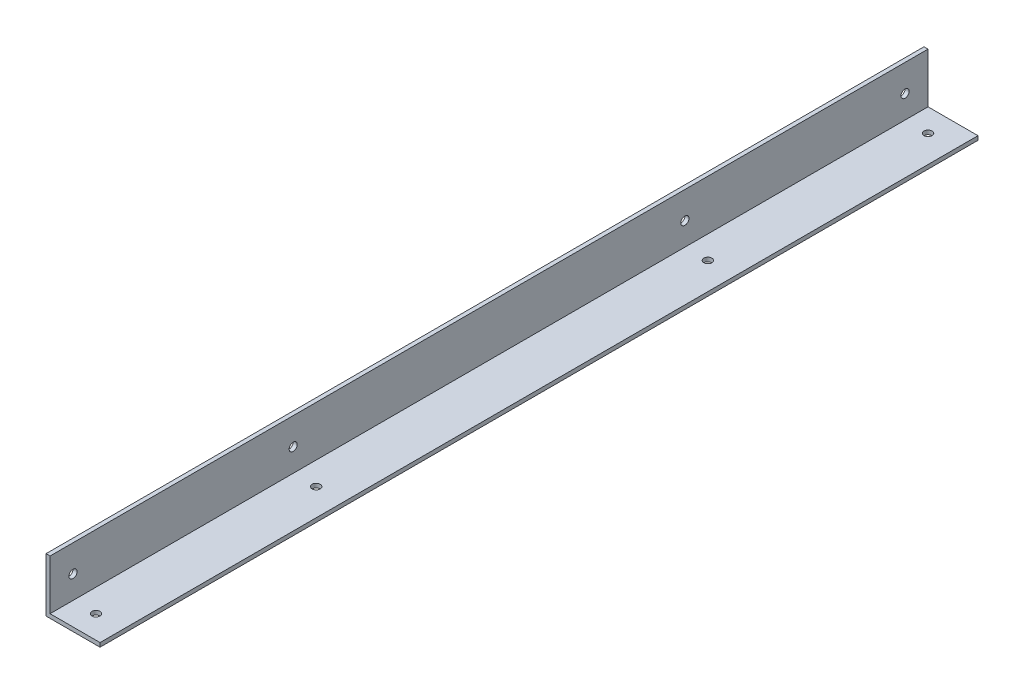
ISO-10303-21;
HEADER;
FILE_DESCRIPTION(('STEP AP214'),'2;1');
FILE_NAME('part.step','',(''),(''),'','','');
FILE_SCHEMA(('AUTOMOTIVE_DESIGN { 1 0 10303 214 1 1 1 1 }'));
ENDSEC;
DATA;
#1=APPLICATION_CONTEXT('core data for automotive mechanical design processes');
#2=APPLICATION_PROTOCOL_DEFINITION('international standard','automotive_design',2000,#1);
#3=PRODUCT_CONTEXT('',#1,'mechanical');
#4=PRODUCT('Part','Part','',(#3));
#5=PRODUCT_RELATED_PRODUCT_CATEGORY('part','',(#4));
#6=PRODUCT_DEFINITION_FORMATION('','',#4);
#7=PRODUCT_DEFINITION_CONTEXT('part definition',#1,'design');
#8=PRODUCT_DEFINITION('design','',#6,#7);
#9=PRODUCT_DEFINITION_SHAPE('','',#8);
#10=(LENGTH_UNIT() NAMED_UNIT(*) SI_UNIT(.MILLI.,.METRE.));
#11=(NAMED_UNIT(*) PLANE_ANGLE_UNIT() SI_UNIT($,.RADIAN.));
#12=(NAMED_UNIT(*) SI_UNIT($,.STERADIAN.) SOLID_ANGLE_UNIT());
#13=UNCERTAINTY_MEASURE_WITH_UNIT(LENGTH_MEASURE(1.E-05),#10,'distance_accuracy_value','');
#14=(GEOMETRIC_REPRESENTATION_CONTEXT(3) GLOBAL_UNCERTAINTY_ASSIGNED_CONTEXT((#13)) GLOBAL_UNIT_ASSIGNED_CONTEXT((#10,
#11,#12)) REPRESENTATION_CONTEXT('',''));
#15=CARTESIAN_POINT('',(0.,0.,0.));
#16=DIRECTION('',(0.,0.,1.));
#17=DIRECTION('',(1.,0.,0.));
#18=AXIS2_PLACEMENT_3D('',#15,#16,#17);
#19=CARTESIAN_POINT('',(-15.9316863798358,4.77336842105263,325.));
#20=DIRECTION('',(0.,-1.,0.));
#21=DIRECTION('',(1.,0.,0.));
#22=AXIS2_PLACEMENT_3D('',#19,#20,#21);
#23=PLANE('',#22);
#24=DIRECTION('',(-1.,0.,0.));
#25=VECTOR('',#24,1.);
#26=CARTESIAN_POINT('',(-15.9316863798358,4.77336842105263,0.));
#27=LINE('',#26,#25);
#28=CARTESIAN_POINT('',(-15.9316863798358,4.77336842105263,0.));
#29=VERTEX_POINT('',#28);
#30=CARTESIAN_POINT('',(-17.4316863798358,4.77336842105263,0.));
#31=VERTEX_POINT('',#30);
#32=EDGE_CURVE('E115',#29,#31,#27,.T.);
#33=ORIENTED_EDGE('',*,*,#32,.T.);
#34=DIRECTION('',(0.,0.,-1.));
#35=VECTOR('',#34,1.);
#36=CARTESIAN_POINT('',(-17.4316863798358,4.77336842105263,325.));
#37=LINE('',#36,#35);
#38=CARTESIAN_POINT('',(-17.4316863798358,4.77336842105263,325.));
#39=VERTEX_POINT('',#38);
#40=EDGE_CURVE('E11',#39,#31,#37,.T.);
#41=ORIENTED_EDGE('',*,*,#40,.F.);
#42=DIRECTION('',(-1.,0.,0.));
#43=VECTOR('',#42,1.);
#44=CARTESIAN_POINT('',(-15.9316863798358,4.77336842105263,325.));
#45=LINE('',#44,#43);
#46=CARTESIAN_POINT('',(-15.9316863798358,4.77336842105263,325.));
#47=VERTEX_POINT('',#46);
#48=EDGE_CURVE('E126',#47,#39,#45,.T.);
#49=ORIENTED_EDGE('',*,*,#48,.F.);
#50=DIRECTION('',(0.,0.,-1.));
#51=VECTOR('',#50,1.);
#52=CARTESIAN_POINT('',(-15.9316863798358,4.77336842105263,325.));
#53=LINE('',#52,#51);
#54=EDGE_CURVE('E111',#47,#29,#53,.T.);
#55=ORIENTED_EDGE('',*,*,#54,.T.);
#56=EDGE_LOOP('',(#33,#41,#49,#55));
#57=FACE_BOUND('',#56,.T.);
#58=ADVANCED_FACE('F31',(#57),#23,.F.);
#59=CARTESIAN_POINT('',(-17.4316863798358,4.77336842105263,325.));
#60=DIRECTION('',(1.,0.,0.));
#61=DIRECTION('',(0.,1.,0.));
#62=AXIS2_PLACEMENT_3D('',#59,#60,#61);
#63=PLANE('',#62);
#64=CARTESIAN_POINT('',(-17.4316863798358,-5.22663157894737,90.));
#65=DIRECTION('',(1.,0.,0.));
#66=DIRECTION('',(0.,1.,0.));
#67=AXIS2_PLACEMENT_3D('',#64,#65,#66);
#68=CIRCLE('',#67,1.5);
#69=CARTESIAN_POINT('',(-17.4316863798358,-3.72663157894737,90.));
#70=VERTEX_POINT('',#69);
#71=EDGE_CURVE('E288',#70,#70,#68,.T.);
#72=ORIENTED_EDGE('',*,*,#71,.T.);
#73=EDGE_LOOP('',(#72));
#74=FACE_BOUND('',#73,.T.);
#75=CARTESIAN_POINT('',(-17.4316863798358,-5.22663157894737,235.));
#76=DIRECTION('',(1.,0.,0.));
#77=DIRECTION('',(0.,1.,0.));
#78=AXIS2_PLACEMENT_3D('',#75,#76,#77);
#79=CIRCLE('',#78,1.50000000000003);
#80=CARTESIAN_POINT('',(-17.4316863798358,-3.72663157894734,235.));
#81=VERTEX_POINT('',#80);
#82=EDGE_CURVE('E292',#81,#81,#79,.T.);
#83=ORIENTED_EDGE('',*,*,#82,.T.);
#84=EDGE_LOOP('',(#83));
#85=FACE_BOUND('',#84,.T.);
#86=CARTESIAN_POINT('',(-17.4316863798358,-5.22663157894737,8.50000000000001));
#87=DIRECTION('',(1.,0.,0.));
#88=DIRECTION('',(0.,1.,0.));
#89=AXIS2_PLACEMENT_3D('',#86,#87,#88);
#90=CIRCLE('',#89,1.5);
#91=CARTESIAN_POINT('',(-17.4316863798358,-3.72663157894737,8.50000000000001));
#92=VERTEX_POINT('',#91);
#93=EDGE_CURVE('E301',#92,#92,#90,.T.);
#94=ORIENTED_EDGE('',*,*,#93,.T.);
#95=EDGE_LOOP('',(#94));
#96=FACE_BOUND('',#95,.T.);
#97=CARTESIAN_POINT('',(-17.4316863798358,-5.22663157894737,316.5));
#98=DIRECTION('',(1.,0.,0.));
#99=DIRECTION('',(0.,1.,0.));
#100=AXIS2_PLACEMENT_3D('',#97,#98,#99);
#101=CIRCLE('',#100,1.50000000000002);
#102=CARTESIAN_POINT('',(-17.4316863798358,-3.72663157894735,316.5));
#103=VERTEX_POINT('',#102);
#104=EDGE_CURVE('E307',#103,#103,#101,.T.);
#105=ORIENTED_EDGE('',*,*,#104,.T.);
#106=EDGE_LOOP('',(#105));
#107=FACE_BOUND('',#106,.T.);
#108=DIRECTION('',(0.,-1.,0.));
#109=VECTOR('',#108,1.);
#110=CARTESIAN_POINT('',(-17.4316863798358,4.77336842105263,0.));
#111=LINE('',#110,#109);
#112=CARTESIAN_POINT('',(-17.4316863798357,-15.2266315789474,0.));
#113=VERTEX_POINT('',#112);
#114=EDGE_CURVE('E118',#31,#113,#111,.T.);
#115=ORIENTED_EDGE('',*,*,#114,.T.);
#116=DIRECTION('',(0.,0.,-1.));
#117=VECTOR('',#116,1.);
#118=CARTESIAN_POINT('',(-17.4316863798357,-15.2266315789474,325.));
#119=LINE('',#118,#117);
#120=CARTESIAN_POINT('',(-17.4316863798357,-15.2266315789474,325.));
#121=VERTEX_POINT('',#120);
#122=EDGE_CURVE('E39',#121,#113,#119,.T.);
#123=ORIENTED_EDGE('',*,*,#122,.F.);
#124=DIRECTION('',(0.,-1.,0.));
#125=VECTOR('',#124,1.);
#126=CARTESIAN_POINT('',(-17.4316863798358,4.77336842105263,325.));
#127=LINE('',#126,#125);
#128=EDGE_CURVE('E84',#39,#121,#127,.T.);
#129=ORIENTED_EDGE('',*,*,#128,.F.);
#130=ORIENTED_EDGE('',*,*,#40,.T.);
#131=EDGE_LOOP('',(#115,#123,#129,#130));
#132=FACE_BOUND('',#131,.T.);
#133=ADVANCED_FACE('F154',(#74,#85,#96,#107,#132),#63,.F.);
#134=CARTESIAN_POINT('',(-17.4316863798357,-15.2266315789474,325.));
#135=DIRECTION('',(0.,1.,0.));
#136=DIRECTION('',(0.,0.,1.));
#137=AXIS2_PLACEMENT_3D('',#134,#135,#136);
#138=PLANE('',#137);
#139=CARTESIAN_POINT('',(-7.43168637983575,-15.2266315789474,90.));
#140=DIRECTION('',(0.,1.,0.));
#141=DIRECTION('',(0.,0.,1.));
#142=AXIS2_PLACEMENT_3D('',#139,#140,#141);
#143=CIRCLE('',#142,1.5);
#144=CARTESIAN_POINT('',(-7.43168637983575,-15.2266315789474,91.5));
#145=VERTEX_POINT('',#144);
#146=EDGE_CURVE('E313',#145,#145,#143,.T.);
#147=ORIENTED_EDGE('',*,*,#146,.T.);
#148=EDGE_LOOP('',(#147));
#149=FACE_BOUND('',#148,.T.);
#150=CARTESIAN_POINT('',(-7.43168637983575,-15.2266315789474,235.));
#151=DIRECTION('',(0.,1.,0.));
#152=DIRECTION('',(0.,0.,1.));
#153=AXIS2_PLACEMENT_3D('',#150,#151,#152);
#154=CIRCLE('',#153,1.5);
#155=CARTESIAN_POINT('',(-7.43168637983575,-15.2266315789474,236.5));
#156=VERTEX_POINT('',#155);
#157=EDGE_CURVE('E319',#156,#156,#154,.T.);
#158=ORIENTED_EDGE('',*,*,#157,.T.);
#159=EDGE_LOOP('',(#158));
#160=FACE_BOUND('',#159,.T.);
#161=CARTESIAN_POINT('',(-7.43168637983575,-15.2266315789474,316.5));
#162=DIRECTION('',(0.,1.,0.));
#163=DIRECTION('',(0.,0.,1.));
#164=AXIS2_PLACEMENT_3D('',#161,#162,#163);
#165=CIRCLE('',#164,1.5);
#166=CARTESIAN_POINT('',(-7.43168637983575,-15.2266315789474,318.));
#167=VERTEX_POINT('',#166);
#168=EDGE_CURVE('E325',#167,#167,#165,.T.);
#169=ORIENTED_EDGE('',*,*,#168,.T.);
#170=EDGE_LOOP('',(#169));
#171=FACE_BOUND('',#170,.T.);
#172=CARTESIAN_POINT('',(-7.43168637983575,-15.2266315789474,8.50000000000001));
#173=DIRECTION('',(0.,1.,0.));
#174=DIRECTION('',(0.,0.,1.));
#175=AXIS2_PLACEMENT_3D('',#172,#173,#174);
#176=CIRCLE('',#175,1.5);
#177=CARTESIAN_POINT('',(-7.43168637983575,-15.2266315789474,10.));
#178=VERTEX_POINT('',#177);
#179=EDGE_CURVE('E119',#178,#178,#176,.T.);
#180=ORIENTED_EDGE('',*,*,#179,.T.);
#181=EDGE_LOOP('',(#180));
#182=FACE_BOUND('',#181,.T.);
#183=DIRECTION('',(1.,0.,0.));
#184=VECTOR('',#183,1.);
#185=CARTESIAN_POINT('',(-17.4316863798357,-15.2266315789474,0.));
#186=LINE('',#185,#184);
#187=CARTESIAN_POINT('',(2.56831362016425,-15.2266315789474,0.));
#188=VERTEX_POINT('',#187);
#189=EDGE_CURVE('E121',#113,#188,#186,.T.);
#190=ORIENTED_EDGE('',*,*,#189,.T.);
#191=DIRECTION('',(0.,0.,-1.));
#192=VECTOR('',#191,1.);
#193=CARTESIAN_POINT('',(2.56831362016425,-15.2266315789474,325.));
#194=LINE('',#193,#192);
#195=CARTESIAN_POINT('',(2.56831362016425,-15.2266315789474,325.));
#196=VERTEX_POINT('',#195);
#197=EDGE_CURVE('E106',#196,#188,#194,.T.);
#198=ORIENTED_EDGE('',*,*,#197,.F.);
#199=DIRECTION('',(1.,0.,0.));
#200=VECTOR('',#199,1.);
#201=CARTESIAN_POINT('',(-17.4316863798357,-15.2266315789474,325.));
#202=LINE('',#201,#200);
#203=EDGE_CURVE('E97',#121,#196,#202,.T.);
#204=ORIENTED_EDGE('',*,*,#203,.F.);
#205=ORIENTED_EDGE('',*,*,#122,.T.);
#206=EDGE_LOOP('',(#190,#198,#204,#205));
#207=FACE_BOUND('',#206,.T.);
#208=ADVANCED_FACE('F132',(#149,#160,#171,#182,#207),#138,.F.);
#209=CARTESIAN_POINT('',(2.56831362016425,-15.2266315789474,325.));
#210=DIRECTION('',(-1.,0.,0.));
#211=DIRECTION('',(0.,0.,1.));
#212=AXIS2_PLACEMENT_3D('',#209,#210,#211);
#213=PLANE('',#212);
#214=DIRECTION('',(0.,1.,0.));
#215=VECTOR('',#214,1.);
#216=CARTESIAN_POINT('',(2.56831362016425,-15.2266315789474,0.));
#217=LINE('',#216,#215);
#218=CARTESIAN_POINT('',(2.56831362016425,-13.7266315789474,0.));
#219=VERTEX_POINT('',#218);
#220=EDGE_CURVE('E105',#188,#219,#217,.T.);
#221=ORIENTED_EDGE('',*,*,#220,.T.);
#222=DIRECTION('',(0.,0.,-1.));
#223=VECTOR('',#222,1.);
#224=CARTESIAN_POINT('',(2.56831362016425,-13.7266315789474,325.));
#225=LINE('',#224,#223);
#226=CARTESIAN_POINT('',(2.56831362016425,-13.7266315789474,325.));
#227=VERTEX_POINT('',#226);
#228=EDGE_CURVE('E102',#227,#219,#225,.T.);
#229=ORIENTED_EDGE('',*,*,#228,.F.);
#230=DIRECTION('',(0.,1.,0.));
#231=VECTOR('',#230,1.);
#232=CARTESIAN_POINT('',(2.56831362016425,-15.2266315789474,325.));
#233=LINE('',#232,#231);
#234=EDGE_CURVE('E91',#196,#227,#233,.T.);
#235=ORIENTED_EDGE('',*,*,#234,.F.);
#236=ORIENTED_EDGE('',*,*,#197,.T.);
#237=EDGE_LOOP('',(#221,#229,#235,#236));
#238=FACE_BOUND('',#237,.T.);
#239=ADVANCED_FACE('F103',(#238),#213,.F.);
#240=CARTESIAN_POINT('',(2.56831362016425,-13.7266315789474,325.));
#241=DIRECTION('',(0.,-1.,0.));
#242=DIRECTION('',(1.,0.,0.));
#243=AXIS2_PLACEMENT_3D('',#240,#241,#242);
#244=PLANE('',#243);
#245=CARTESIAN_POINT('',(-7.43168637983575,-13.7266315789474,90.));
#246=DIRECTION('',(0.,1.,0.));
#247=DIRECTION('',(-1.,0.,0.));
#248=AXIS2_PLACEMENT_3D('',#245,#246,#247);
#249=CIRCLE('',#248,1.5);
#250=CARTESIAN_POINT('',(-8.93168637983575,-13.7266315789474,90.));
#251=VERTEX_POINT('',#250);
#252=EDGE_CURVE('E310',#251,#251,#249,.T.);
#253=ORIENTED_EDGE('',*,*,#252,.F.);
#254=EDGE_LOOP('',(#253));
#255=FACE_BOUND('',#254,.T.);
#256=CARTESIAN_POINT('',(-7.43168637983575,-13.7266315789474,235.));
#257=DIRECTION('',(0.,1.,0.));
#258=DIRECTION('',(-1.,0.,0.));
#259=AXIS2_PLACEMENT_3D('',#256,#257,#258);
#260=CIRCLE('',#259,1.5);
#261=CARTESIAN_POINT('',(-8.93168637983575,-13.7266315789474,235.));
#262=VERTEX_POINT('',#261);
#263=EDGE_CURVE('E316',#262,#262,#260,.T.);
#264=ORIENTED_EDGE('',*,*,#263,.F.);
#265=EDGE_LOOP('',(#264));
#266=FACE_BOUND('',#265,.T.);
#267=CARTESIAN_POINT('',(-7.43168637983575,-13.7266315789474,316.5));
#268=DIRECTION('',(0.,1.,0.));
#269=DIRECTION('',(-1.,0.,0.));
#270=AXIS2_PLACEMENT_3D('',#267,#268,#269);
#271=CIRCLE('',#270,1.5);
#272=CARTESIAN_POINT('',(-8.93168637983575,-13.7266315789474,316.5));
#273=VERTEX_POINT('',#272);
#274=EDGE_CURVE('E322',#273,#273,#271,.T.);
#275=ORIENTED_EDGE('',*,*,#274,.F.);
#276=EDGE_LOOP('',(#275));
#277=FACE_BOUND('',#276,.T.);
#278=CARTESIAN_POINT('',(-7.43168637983575,-13.7266315789474,8.50000000000001));
#279=DIRECTION('',(0.,1.,0.));
#280=DIRECTION('',(-1.,0.,0.));
#281=AXIS2_PLACEMENT_3D('',#278,#279,#280);
#282=CIRCLE('',#281,1.5);
#283=CARTESIAN_POINT('',(-8.93168637983575,-13.7266315789474,8.50000000000001));
#284=VERTEX_POINT('',#283);
#285=EDGE_CURVE('E328',#284,#284,#282,.T.);
#286=ORIENTED_EDGE('',*,*,#285,.F.);
#287=EDGE_LOOP('',(#286));
#288=FACE_BOUND('',#287,.T.);
#289=DIRECTION('',(-1.,0.,0.));
#290=VECTOR('',#289,1.);
#291=CARTESIAN_POINT('',(2.56831362016425,-13.7266315789474,0.));
#292=LINE('',#291,#290);
#293=CARTESIAN_POINT('',(-15.9316863798358,-13.7266315789474,0.));
#294=VERTEX_POINT('',#293);
#295=EDGE_CURVE('E70',#219,#294,#292,.T.);
#296=ORIENTED_EDGE('',*,*,#295,.T.);
#297=DIRECTION('',(0.,0.,-1.));
#298=VECTOR('',#297,1.);
#299=CARTESIAN_POINT('',(-15.9316863798358,-13.7266315789474,325.));
#300=LINE('',#299,#298);
#301=CARTESIAN_POINT('',(-15.9316863798358,-13.7266315789474,325.));
#302=VERTEX_POINT('',#301);
#303=EDGE_CURVE('E107',#302,#294,#300,.T.);
#304=ORIENTED_EDGE('',*,*,#303,.F.);
#305=DIRECTION('',(-1.,0.,0.));
#306=VECTOR('',#305,1.);
#307=CARTESIAN_POINT('',(2.56831362016425,-13.7266315789474,325.));
#308=LINE('',#307,#306);
#309=EDGE_CURVE('E95',#227,#302,#308,.T.);
#310=ORIENTED_EDGE('',*,*,#309,.F.);
#311=ORIENTED_EDGE('',*,*,#228,.T.);
#312=EDGE_LOOP('',(#296,#304,#310,#311));
#313=FACE_BOUND('',#312,.T.);
#314=ADVANCED_FACE('F109',(#255,#266,#277,#288,#313),#244,.F.);
#315=CARTESIAN_POINT('',(-15.9316863798358,-13.7266315789474,325.));
#316=DIRECTION('',(-1.,0.,0.));
#317=DIRECTION('',(0.,0.,1.));
#318=AXIS2_PLACEMENT_3D('',#315,#316,#317);
#319=PLANE('',#318);
#320=CARTESIAN_POINT('',(-15.9316863798358,-5.22663157894737,90.));
#321=DIRECTION('',(1.,0.,0.));
#322=DIRECTION('',(0.,0.,-1.));
#323=AXIS2_PLACEMENT_3D('',#320,#321,#322);
#324=CIRCLE('',#323,1.5);
#325=CARTESIAN_POINT('',(-15.9316863798358,-5.22663157894737,88.5));
#326=VERTEX_POINT('',#325);
#327=EDGE_CURVE('E286',#326,#326,#324,.T.);
#328=ORIENTED_EDGE('',*,*,#327,.F.);
#329=EDGE_LOOP('',(#328));
#330=FACE_BOUND('',#329,.T.);
#331=CARTESIAN_POINT('',(-15.9316863798358,-5.22663157894737,235.));
#332=DIRECTION('',(1.,0.,0.));
#333=DIRECTION('',(0.,0.,-1.));
#334=AXIS2_PLACEMENT_3D('',#331,#332,#333);
#335=CIRCLE('',#334,1.50000000000003);
#336=CARTESIAN_POINT('',(-15.9316863798358,-5.22663157894737,233.5));
#337=VERTEX_POINT('',#336);
#338=EDGE_CURVE('E289',#337,#337,#335,.T.);
#339=ORIENTED_EDGE('',*,*,#338,.F.);
#340=EDGE_LOOP('',(#339));
#341=FACE_BOUND('',#340,.T.);
#342=CARTESIAN_POINT('',(-15.9316863798358,-5.22663157894737,8.50000000000001));
#343=DIRECTION('',(1.,0.,0.));
#344=DIRECTION('',(0.,0.,-1.));
#345=AXIS2_PLACEMENT_3D('',#342,#343,#344);
#346=CIRCLE('',#345,1.5);
#347=CARTESIAN_POINT('',(-15.9316863798358,-5.22663157894737,7.00000000000001));
#348=VERTEX_POINT('',#347);
#349=EDGE_CURVE('E298',#348,#348,#346,.T.);
#350=ORIENTED_EDGE('',*,*,#349,.F.);
#351=EDGE_LOOP('',(#350));
#352=FACE_BOUND('',#351,.T.);
#353=CARTESIAN_POINT('',(-15.9316863798358,-5.22663157894737,316.5));
#354=DIRECTION('',(1.,0.,0.));
#355=DIRECTION('',(0.,0.,-1.));
#356=AXIS2_PLACEMENT_3D('',#353,#354,#355);
#357=CIRCLE('',#356,1.50000000000002);
#358=CARTESIAN_POINT('',(-15.9316863798358,-5.22663157894737,315.));
#359=VERTEX_POINT('',#358);
#360=EDGE_CURVE('E304',#359,#359,#357,.T.);
#361=ORIENTED_EDGE('',*,*,#360,.F.);
#362=EDGE_LOOP('',(#361));
#363=FACE_BOUND('',#362,.T.);
#364=DIRECTION('',(0.,1.,0.));
#365=VECTOR('',#364,1.);
#366=CARTESIAN_POINT('',(-15.9316863798358,-13.7266315789474,0.));
#367=LINE('',#366,#365);
#368=EDGE_CURVE('E76',#294,#29,#367,.T.);
#369=ORIENTED_EDGE('',*,*,#368,.T.);
#370=ORIENTED_EDGE('',*,*,#54,.F.);
#371=DIRECTION('',(0.,1.,0.));
#372=VECTOR('',#371,1.);
#373=CARTESIAN_POINT('',(-15.9316863798358,-13.7266315789474,325.));
#374=LINE('',#373,#372);
#375=EDGE_CURVE('E47',#302,#47,#374,.T.);
#376=ORIENTED_EDGE('',*,*,#375,.F.);
#377=ORIENTED_EDGE('',*,*,#303,.T.);
#378=EDGE_LOOP('',(#369,#370,#376,#377));
#379=FACE_BOUND('',#378,.T.);
#380=ADVANCED_FACE('F139',(#330,#341,#352,#363,#379),#319,.F.);
#381=CARTESIAN_POINT('',(-17.4316863798358,4.77336842105263,325.));
#382=DIRECTION('',(0.,0.,1.));
#383=DIRECTION('',(1.,0.,0.));
#384=AXIS2_PLACEMENT_3D('',#381,#382,#383);
#385=PLANE('',#384);
#386=ORIENTED_EDGE('',*,*,#48,.T.);
#387=ORIENTED_EDGE('',*,*,#128,.T.);
#388=ORIENTED_EDGE('',*,*,#203,.T.);
#389=ORIENTED_EDGE('',*,*,#234,.T.);
#390=ORIENTED_EDGE('',*,*,#309,.T.);
#391=ORIENTED_EDGE('',*,*,#375,.T.);
#392=EDGE_LOOP('',(#386,#387,#388,#389,#390,#391));
#393=FACE_BOUND('',#392,.T.);
#394=ADVANCED_FACE('F93',(#393),#385,.T.);
#395=CARTESIAN_POINT('',(-17.4316863798358,4.77336842105263,0.));
#396=DIRECTION('',(0.,0.,1.));
#397=DIRECTION('',(1.,0.,0.));
#398=AXIS2_PLACEMENT_3D('',#395,#396,#397);
#399=PLANE('',#398);
#400=ORIENTED_EDGE('',*,*,#32,.F.);
#401=ORIENTED_EDGE('',*,*,#368,.F.);
#402=ORIENTED_EDGE('',*,*,#295,.F.);
#403=ORIENTED_EDGE('',*,*,#220,.F.);
#404=ORIENTED_EDGE('',*,*,#189,.F.);
#405=ORIENTED_EDGE('',*,*,#114,.F.);
#406=EDGE_LOOP('',(#400,#401,#402,#403,#404,#405));
#407=FACE_BOUND('',#406,.T.);
#408=ADVANCED_FACE('F135',(#407),#399,.F.);
#409=CARTESIAN_POINT('',(-7.43168637983563,-313.726631578947,8.50000000000001));
#410=DIRECTION('',(0.,1.,0.));
#411=DIRECTION('',(-1.,0.,0.));
#412=AXIS2_PLACEMENT_3D('',#409,#410,#411);
#413=CYLINDRICAL_SURFACE('',#412,1.5);
#414=ORIENTED_EDGE('',*,*,#285,.T.);
#415=EDGE_LOOP('',(#414));
#416=FACE_BOUND('',#415,.T.);
#417=ORIENTED_EDGE('',*,*,#179,.F.);
#418=EDGE_LOOP('',(#417));
#419=FACE_BOUND('',#418,.T.);
#420=ADVANCED_FACE('F186',(#416,#419),#413,.F.);
#421=CARTESIAN_POINT('',(-7.43168637983563,-313.726631578947,316.5));
#422=DIRECTION('',(0.,1.,0.));
#423=DIRECTION('',(-1.,0.,0.));
#424=AXIS2_PLACEMENT_3D('',#421,#422,#423);
#425=CYLINDRICAL_SURFACE('',#424,1.5);
#426=ORIENTED_EDGE('',*,*,#274,.T.);
#427=EDGE_LOOP('',(#426));
#428=FACE_BOUND('',#427,.T.);
#429=ORIENTED_EDGE('',*,*,#168,.F.);
#430=EDGE_LOOP('',(#429));
#431=FACE_BOUND('',#430,.T.);
#432=ADVANCED_FACE('F191',(#428,#431),#425,.F.);
#433=CARTESIAN_POINT('',(-7.43168637983563,-313.726631578947,235.));
#434=DIRECTION('',(0.,1.,0.));
#435=DIRECTION('',(-1.,0.,0.));
#436=AXIS2_PLACEMENT_3D('',#433,#434,#435);
#437=CYLINDRICAL_SURFACE('',#436,1.5);
#438=ORIENTED_EDGE('',*,*,#263,.T.);
#439=EDGE_LOOP('',(#438));
#440=FACE_BOUND('',#439,.T.);
#441=ORIENTED_EDGE('',*,*,#157,.F.);
#442=EDGE_LOOP('',(#441));
#443=FACE_BOUND('',#442,.T.);
#444=ADVANCED_FACE('F203',(#440,#443),#437,.F.);
#445=CARTESIAN_POINT('',(-7.43168637983563,-313.726631578947,90.));
#446=DIRECTION('',(0.,1.,0.));
#447=DIRECTION('',(-1.,0.,0.));
#448=AXIS2_PLACEMENT_3D('',#445,#446,#447);
#449=CYLINDRICAL_SURFACE('',#448,1.5);
#450=ORIENTED_EDGE('',*,*,#252,.T.);
#451=EDGE_LOOP('',(#450));
#452=FACE_BOUND('',#451,.T.);
#453=ORIENTED_EDGE('',*,*,#146,.F.);
#454=EDGE_LOOP('',(#453));
#455=FACE_BOUND('',#454,.T.);
#456=ADVANCED_FACE('F213',(#452,#455),#449,.F.);
#457=CARTESIAN_POINT('',(-315.931686379836,-5.22663157894737,316.5));
#458=DIRECTION('',(1.,0.,0.));
#459=DIRECTION('',(0.,0.,-1.));
#460=AXIS2_PLACEMENT_3D('',#457,#458,#459);
#461=CYLINDRICAL_SURFACE('',#460,1.50000000000002);
#462=ORIENTED_EDGE('',*,*,#360,.T.);
#463=EDGE_LOOP('',(#462));
#464=FACE_BOUND('',#463,.T.);
#465=ORIENTED_EDGE('',*,*,#104,.F.);
#466=EDGE_LOOP('',(#465));
#467=FACE_BOUND('',#466,.T.);
#468=ADVANCED_FACE('F222',(#464,#467),#461,.F.);
#469=CARTESIAN_POINT('',(-315.931686379836,-5.22663157894737,8.50000000000001));
#470=DIRECTION('',(1.,0.,0.));
#471=DIRECTION('',(0.,0.,-1.));
#472=AXIS2_PLACEMENT_3D('',#469,#470,#471);
#473=CYLINDRICAL_SURFACE('',#472,1.5);
#474=ORIENTED_EDGE('',*,*,#349,.T.);
#475=EDGE_LOOP('',(#474));
#476=FACE_BOUND('',#475,.T.);
#477=ORIENTED_EDGE('',*,*,#93,.F.);
#478=EDGE_LOOP('',(#477));
#479=FACE_BOUND('',#478,.T.);
#480=ADVANCED_FACE('F242',(#476,#479),#473,.F.);
#481=CARTESIAN_POINT('',(-315.931686379836,-5.22663157894737,235.));
#482=DIRECTION('',(1.,0.,0.));
#483=DIRECTION('',(0.,0.,-1.));
#484=AXIS2_PLACEMENT_3D('',#481,#482,#483);
#485=CYLINDRICAL_SURFACE('',#484,1.50000000000003);
#486=ORIENTED_EDGE('',*,*,#338,.T.);
#487=EDGE_LOOP('',(#486));
#488=FACE_BOUND('',#487,.T.);
#489=ORIENTED_EDGE('',*,*,#82,.F.);
#490=EDGE_LOOP('',(#489));
#491=FACE_BOUND('',#490,.T.);
#492=ADVANCED_FACE('F252',(#488,#491),#485,.F.);
#493=CARTESIAN_POINT('',(-315.931686379836,-5.22663157894737,90.));
#494=DIRECTION('',(1.,0.,0.));
#495=DIRECTION('',(0.,0.,-1.));
#496=AXIS2_PLACEMENT_3D('',#493,#494,#495);
#497=CYLINDRICAL_SURFACE('',#496,1.5);
#498=ORIENTED_EDGE('',*,*,#327,.T.);
#499=EDGE_LOOP('',(#498));
#500=FACE_BOUND('',#499,.T.);
#501=ORIENTED_EDGE('',*,*,#71,.F.);
#502=EDGE_LOOP('',(#501));
#503=FACE_BOUND('',#502,.T.);
#504=ADVANCED_FACE('F262',(#500,#503),#497,.F.);
#505=CLOSED_SHELL('',(#58,#133,#208,#239,#314,#380,#394,#408,#420,#432,#444,#456,#468,#480,#492,#504));
#506=MANIFOLD_SOLID_BREP('B2',#505);
#507=ADVANCED_BREP_SHAPE_REPRESENTATION('',(#18,#506),#14);
#508=SHAPE_DEFINITION_REPRESENTATION(#9,#507);
ENDSEC;
END-ISO-10303-21;
